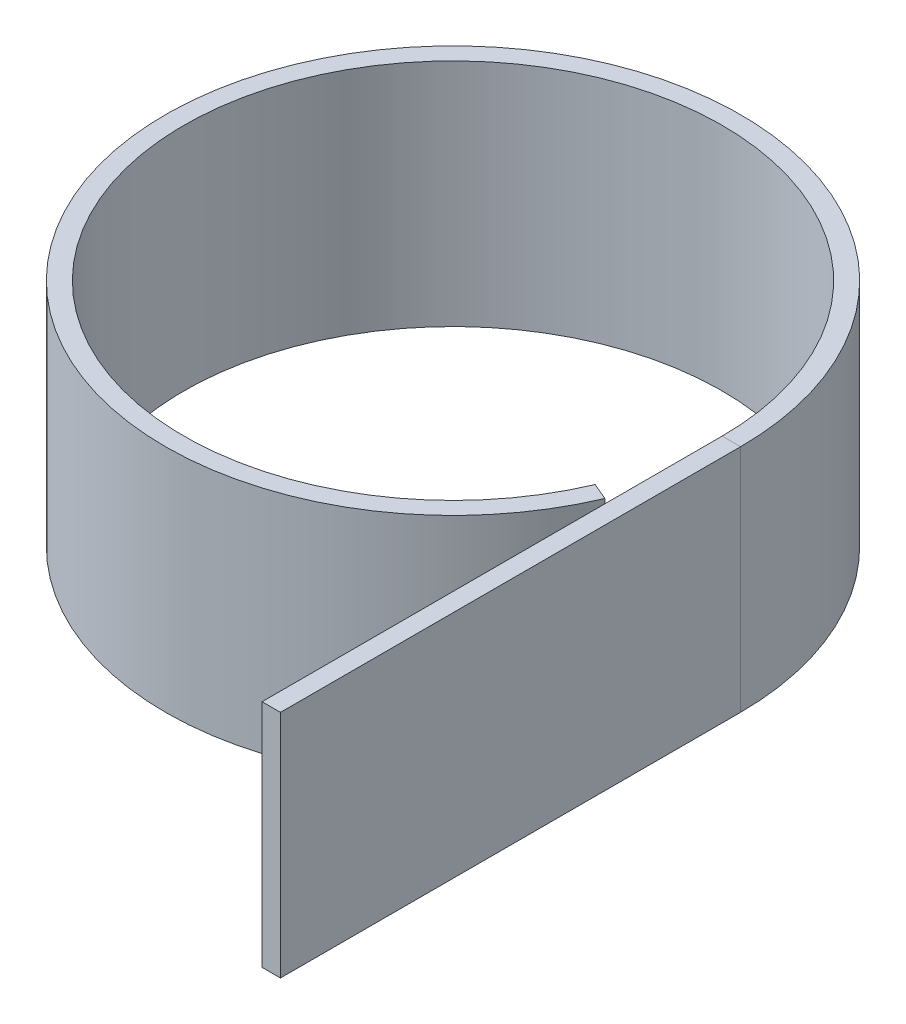
ISO-10303-21;
HEADER;
FILE_DESCRIPTION(('STEP AP214'),'2;1');
FILE_NAME('part.step','',(''),(''),'','','');
FILE_SCHEMA(('AUTOMOTIVE_DESIGN { 1 0 10303 214 1 1 1 1 }'));
ENDSEC;
DATA;
#1=APPLICATION_CONTEXT('core data for automotive mechanical design processes');
#2=APPLICATION_PROTOCOL_DEFINITION('international standard','automotive_design',2000,#1);
#3=PRODUCT_CONTEXT('',#1,'mechanical');
#4=PRODUCT('Part','Part','',(#3));
#5=PRODUCT_RELATED_PRODUCT_CATEGORY('part','',(#4));
#6=PRODUCT_DEFINITION_FORMATION('','',#4);
#7=PRODUCT_DEFINITION_CONTEXT('part definition',#1,'design');
#8=PRODUCT_DEFINITION('design','',#6,#7);
#9=PRODUCT_DEFINITION_SHAPE('','',#8);
#10=(LENGTH_UNIT() NAMED_UNIT(*) SI_UNIT(.MILLI.,.METRE.));
#11=(NAMED_UNIT(*) PLANE_ANGLE_UNIT() SI_UNIT($,.RADIAN.));
#12=(NAMED_UNIT(*) SI_UNIT($,.STERADIAN.) SOLID_ANGLE_UNIT());
#13=UNCERTAINTY_MEASURE_WITH_UNIT(LENGTH_MEASURE(1.E-05),#10,'distance_accuracy_value','');
#14=(GEOMETRIC_REPRESENTATION_CONTEXT(3) GLOBAL_UNCERTAINTY_ASSIGNED_CONTEXT((#13)) GLOBAL_UNIT_ASSIGNED_CONTEXT((#10,
#11,#12)) REPRESENTATION_CONTEXT('',''));
#15=CARTESIAN_POINT('',(0.,0.,0.));
#16=DIRECTION('',(0.,0.,1.));
#17=DIRECTION('',(1.,0.,0.));
#18=AXIS2_PLACEMENT_3D('',#15,#16,#17);
#19=CARTESIAN_POINT('',(12.5,10.,0.));
#20=DIRECTION('',(0.,1.,0.));
#21=DIRECTION('',(0.,0.,1.));
#22=AXIS2_PLACEMENT_3D('',#19,#20,#21);
#23=PLANE('',#22);
#24=DIRECTION('',(-1.,0.,0.));
#25=VECTOR('',#24,1.);
#26=CARTESIAN_POINT('',(12.5,10.,0.));
#27=LINE('',#26,#25);
#28=CARTESIAN_POINT('',(12.5,10.,0.));
#29=VERTEX_POINT('',#28);
#30=CARTESIAN_POINT('',(11.7,10.,0.));
#31=VERTEX_POINT('',#30);
#32=EDGE_CURVE('E11',#29,#31,#27,.T.);
#33=ORIENTED_EDGE('',*,*,#32,.F.);
#34=CARTESIAN_POINT('',(0.,10.,0.));
#35=DIRECTION('',(0.,-1.,0.));
#36=DIRECTION('',(0.,0.,1.));
#37=AXIS2_PLACEMENT_3D('',#34,#35,#36);
#38=CIRCLE('',#37,12.5);
#39=CARTESIAN_POINT('',(11.5,10.,4.89897948556636));
#40=VERTEX_POINT('',#39);
#41=EDGE_CURVE('E104',#40,#29,#38,.T.);
#42=ORIENTED_EDGE('',*,*,#41,.F.);
#43=DIRECTION('',(0.920000000000001,0.,0.391918358845305));
#44=VECTOR('',#43,1.);
#45=CARTESIAN_POINT('',(10.764,10.,4.58544479849011));
#46=LINE('',#45,#44);
#47=CARTESIAN_POINT('',(10.764,10.,4.58544479849011));
#48=VERTEX_POINT('',#47);
#49=EDGE_CURVE('E114',#48,#40,#46,.T.);
#50=ORIENTED_EDGE('',*,*,#49,.F.);
#51=CARTESIAN_POINT('',(0.,10.,0.));
#52=DIRECTION('',(0.,1.,0.));
#53=DIRECTION('',(1.,0.,0.));
#54=AXIS2_PLACEMENT_3D('',#51,#52,#53);
#55=CIRCLE('',#54,11.7);
#56=EDGE_CURVE('E119',#48,#31,#55,.F.);
#57=ORIENTED_EDGE('',*,*,#56,.T.);
#58=EDGE_LOOP('',(#33,#42,#50,#57));
#59=FACE_BOUND('',#58,.T.);
#60=ADVANCED_FACE('F43',(#59),#23,.T.);
#61=CARTESIAN_POINT('',(11.7,0.,0.));
#62=DIRECTION('',(0.,-1.,0.));
#63=DIRECTION('',(0.,0.,-1.));
#64=AXIS2_PLACEMENT_3D('',#61,#62,#63);
#65=PLANE('',#64);
#66=DIRECTION('',(1.,0.,0.));
#67=VECTOR('',#66,1.);
#68=CARTESIAN_POINT('',(11.7,0.,0.));
#69=LINE('',#68,#67);
#70=CARTESIAN_POINT('',(11.7,0.,0.));
#71=VERTEX_POINT('',#70);
#72=CARTESIAN_POINT('',(12.5,0.,0.));
#73=VERTEX_POINT('',#72);
#74=EDGE_CURVE('E51',#71,#73,#69,.T.);
#75=ORIENTED_EDGE('',*,*,#74,.F.);
#76=CARTESIAN_POINT('',(0.,0.,0.));
#77=DIRECTION('',(0.,1.,0.));
#78=DIRECTION('',(1.,0.,0.));
#79=AXIS2_PLACEMENT_3D('',#76,#77,#78);
#80=CIRCLE('',#79,11.7);
#81=CARTESIAN_POINT('',(10.764,0.,4.58544479849011));
#82=VERTEX_POINT('',#81);
#83=EDGE_CURVE('E137',#82,#71,#80,.F.);
#84=ORIENTED_EDGE('',*,*,#83,.F.);
#85=DIRECTION('',(0.920000000000001,0.,0.391918358845305));
#86=VECTOR('',#85,1.);
#87=CARTESIAN_POINT('',(10.764,0.,4.58544479849011));
#88=LINE('',#87,#86);
#89=CARTESIAN_POINT('',(11.5,0.,4.89897948556636));
#90=VERTEX_POINT('',#89);
#91=EDGE_CURVE('E135',#82,#90,#88,.T.);
#92=ORIENTED_EDGE('',*,*,#91,.T.);
#93=CARTESIAN_POINT('',(0.,0.,0.));
#94=DIRECTION('',(0.,-1.,0.));
#95=DIRECTION('',(0.,0.,1.));
#96=AXIS2_PLACEMENT_3D('',#93,#94,#95);
#97=CIRCLE('',#96,12.5);
#98=EDGE_CURVE('E105',#90,#73,#97,.T.);
#99=ORIENTED_EDGE('',*,*,#98,.T.);
#100=EDGE_LOOP('',(#75,#84,#92,#99));
#101=FACE_BOUND('',#100,.T.);
#102=ADVANCED_FACE('F154',(#101),#65,.T.);
#103=CARTESIAN_POINT('',(11.7,10.,0.));
#104=DIRECTION('',(1.,0.,0.));
#105=DIRECTION('',(0.,0.,-1.));
#106=AXIS2_PLACEMENT_3D('',#103,#104,#105);
#107=PLANE('',#106);
#108=DIRECTION('',(0.,0.,1.));
#109=VECTOR('',#108,1.);
#110=CARTESIAN_POINT('',(11.7,0.,0.));
#111=LINE('',#110,#109);
#112=CARTESIAN_POINT('',(11.7,0.,20.));
#113=VERTEX_POINT('',#112);
#114=EDGE_CURVE('E125',#71,#113,#111,.T.);
#115=ORIENTED_EDGE('',*,*,#114,.T.);
#116=DIRECTION('',(0.,-1.,0.));
#117=VECTOR('',#116,1.);
#118=CARTESIAN_POINT('',(11.7,10.,20.));
#119=LINE('',#118,#117);
#120=CARTESIAN_POINT('',(11.7,10.,20.));
#121=VERTEX_POINT('',#120);
#122=EDGE_CURVE('E145',#121,#113,#119,.T.);
#123=ORIENTED_EDGE('',*,*,#122,.F.);
#124=DIRECTION('',(0.,0.,1.));
#125=VECTOR('',#124,1.);
#126=CARTESIAN_POINT('',(11.7,10.,0.));
#127=LINE('',#126,#125);
#128=EDGE_CURVE('E90',#31,#121,#127,.T.);
#129=ORIENTED_EDGE('',*,*,#128,.F.);
#130=DIRECTION('',(0.,-1.,0.));
#131=VECTOR('',#130,1.);
#132=CARTESIAN_POINT('',(11.7,10.,0.));
#133=LINE('',#132,#131);
#134=EDGE_CURVE('E121',#31,#71,#133,.T.);
#135=ORIENTED_EDGE('',*,*,#134,.T.);
#136=EDGE_LOOP('',(#115,#123,#129,#135));
#137=FACE_BOUND('',#136,.T.);
#138=ADVANCED_FACE('F158',(#137),#107,.F.);
#139=CARTESIAN_POINT('',(12.5,10.,20.));
#140=DIRECTION('',(0.,0.,1.));
#141=DIRECTION('',(1.,0.,0.));
#142=AXIS2_PLACEMENT_3D('',#139,#140,#141);
#143=PLANE('',#142);
#144=DIRECTION('',(-1.,0.,0.));
#145=VECTOR('',#144,1.);
#146=CARTESIAN_POINT('',(12.5,0.,20.));
#147=LINE('',#146,#145);
#148=CARTESIAN_POINT('',(12.5,0.,20.));
#149=VERTEX_POINT('',#148);
#150=EDGE_CURVE('E128',#149,#113,#147,.T.);
#151=ORIENTED_EDGE('',*,*,#150,.F.);
#152=DIRECTION('',(0.,-1.,0.));
#153=VECTOR('',#152,1.);
#154=CARTESIAN_POINT('',(12.5,10.,20.));
#155=LINE('',#154,#153);
#156=CARTESIAN_POINT('',(12.5,10.,20.));
#157=VERTEX_POINT('',#156);
#158=EDGE_CURVE('E143',#157,#149,#155,.T.);
#159=ORIENTED_EDGE('',*,*,#158,.F.);
#160=DIRECTION('',(-1.,0.,0.));
#161=VECTOR('',#160,1.);
#162=CARTESIAN_POINT('',(12.5,10.,20.));
#163=LINE('',#162,#161);
#164=EDGE_CURVE('E160',#157,#121,#163,.T.);
#165=ORIENTED_EDGE('',*,*,#164,.T.);
#166=ORIENTED_EDGE('',*,*,#122,.T.);
#167=EDGE_LOOP('',(#151,#159,#165,#166));
#168=FACE_BOUND('',#167,.T.);
#169=ADVANCED_FACE('F165',(#168),#143,.T.);
#170=CARTESIAN_POINT('',(12.5,10.,0.));
#171=DIRECTION('',(1.,0.,0.));
#172=DIRECTION('',(0.,0.,-1.));
#173=AXIS2_PLACEMENT_3D('',#170,#171,#172);
#174=PLANE('',#173);
#175=DIRECTION('',(0.,0.,1.));
#176=VECTOR('',#175,1.);
#177=CARTESIAN_POINT('',(12.5,0.,0.));
#178=LINE('',#177,#176);
#179=EDGE_CURVE('E131',#73,#149,#178,.T.);
#180=ORIENTED_EDGE('',*,*,#179,.F.);
#181=DIRECTION('',(0.,-1.,0.));
#182=VECTOR('',#181,1.);
#183=CARTESIAN_POINT('',(12.5,10.,0.));
#184=LINE('',#183,#182);
#185=EDGE_CURVE('E110',#29,#73,#184,.T.);
#186=ORIENTED_EDGE('',*,*,#185,.F.);
#187=DIRECTION('',(0.,0.,1.));
#188=VECTOR('',#187,1.);
#189=CARTESIAN_POINT('',(12.5,10.,0.));
#190=LINE('',#189,#188);
#191=EDGE_CURVE('E116',#29,#157,#190,.T.);
#192=ORIENTED_EDGE('',*,*,#191,.T.);
#193=ORIENTED_EDGE('',*,*,#158,.T.);
#194=EDGE_LOOP('',(#180,#186,#192,#193));
#195=FACE_BOUND('',#194,.T.);
#196=ADVANCED_FACE('F152',(#195),#174,.T.);
#197=CARTESIAN_POINT('',(0.,10.,0.));
#198=DIRECTION('',(0.,-1.,0.));
#199=DIRECTION('',(0.,0.,-1.));
#200=AXIS2_PLACEMENT_3D('',#197,#198,#199);
#201=CYLINDRICAL_SURFACE('',#200,12.5);
#202=ORIENTED_EDGE('',*,*,#98,.F.);
#203=DIRECTION('',(0.,-1.,0.));
#204=VECTOR('',#203,1.);
#205=CARTESIAN_POINT('',(11.5,10.,4.89897948556636));
#206=LINE('',#205,#204);
#207=EDGE_CURVE('E100',#40,#90,#206,.T.);
#208=ORIENTED_EDGE('',*,*,#207,.F.);
#209=ORIENTED_EDGE('',*,*,#41,.T.);
#210=ORIENTED_EDGE('',*,*,#185,.T.);
#211=EDGE_LOOP('',(#202,#208,#209,#210));
#212=FACE_BOUND('',#211,.T.);
#213=ADVANCED_FACE('F102',(#212),#201,.T.);
#214=CARTESIAN_POINT('',(10.764,10.,4.58544479849011));
#215=DIRECTION('',(0.391918358845305,0.,-0.920000000000001));
#216=DIRECTION('',(-0.920000000000001,0.,-0.391918358845305));
#217=AXIS2_PLACEMENT_3D('',#214,#215,#216);
#218=PLANE('',#217);
#219=ORIENTED_EDGE('',*,*,#91,.F.);
#220=DIRECTION('',(0.,-1.,0.));
#221=VECTOR('',#220,1.);
#222=CARTESIAN_POINT('',(10.764,10.,4.58544479849011));
#223=LINE('',#222,#221);
#224=EDGE_CURVE('E80',#48,#82,#223,.T.);
#225=ORIENTED_EDGE('',*,*,#224,.F.);
#226=ORIENTED_EDGE('',*,*,#49,.T.);
#227=ORIENTED_EDGE('',*,*,#207,.T.);
#228=EDGE_LOOP('',(#219,#225,#226,#227));
#229=FACE_BOUND('',#228,.T.);
#230=ADVANCED_FACE('F118',(#229),#218,.T.);
#231=CARTESIAN_POINT('',(0.,10.,0.));
#232=DIRECTION('',(0.,-1.,0.));
#233=DIRECTION('',(0.,0.,-1.));
#234=AXIS2_PLACEMENT_3D('',#231,#232,#233);
#235=CYLINDRICAL_SURFACE('',#234,11.7);
#236=ORIENTED_EDGE('',*,*,#83,.T.);
#237=ORIENTED_EDGE('',*,*,#134,.F.);
#238=ORIENTED_EDGE('',*,*,#56,.F.);
#239=ORIENTED_EDGE('',*,*,#224,.T.);
#240=EDGE_LOOP('',(#236,#237,#238,#239));
#241=FACE_BOUND('',#240,.T.);
#242=ADVANCED_FACE('F156',(#241),#235,.F.);
#243=CARTESIAN_POINT('',(0.,10.,0.));
#244=DIRECTION('',(0.,-1.,0.));
#245=DIRECTION('',(-1.,0.,0.));
#246=AXIS2_PLACEMENT_3D('',#243,#244,#245);
#247=PLANE('',#246);
#248=ORIENTED_EDGE('',*,*,#128,.T.);
#249=ORIENTED_EDGE('',*,*,#164,.F.);
#250=ORIENTED_EDGE('',*,*,#191,.F.);
#251=ORIENTED_EDGE('',*,*,#32,.T.);
#252=EDGE_LOOP('',(#248,#249,#250,#251));
#253=FACE_BOUND('',#252,.T.);
#254=ADVANCED_FACE('F163',(#253),#247,.F.);
#255=CARTESIAN_POINT('',(0.,0.,0.));
#256=DIRECTION('',(0.,-1.,0.));
#257=DIRECTION('',(-1.,0.,0.));
#258=AXIS2_PLACEMENT_3D('',#255,#256,#257);
#259=PLANE('',#258);
#260=ORIENTED_EDGE('',*,*,#114,.F.);
#261=ORIENTED_EDGE('',*,*,#74,.T.);
#262=ORIENTED_EDGE('',*,*,#179,.T.);
#263=ORIENTED_EDGE('',*,*,#150,.T.);
#264=EDGE_LOOP('',(#260,#261,#262,#263));
#265=FACE_BOUND('',#264,.T.);
#266=ADVANCED_FACE('F148',(#265),#259,.T.);
#267=CLOSED_SHELL('',(#60,#102,#138,#169,#196,#213,#230,#242,#254,#266));
#268=MANIFOLD_SOLID_BREP('B2',#267);
#269=ADVANCED_BREP_SHAPE_REPRESENTATION('',(#18,#268),#14);
#270=SHAPE_DEFINITION_REPRESENTATION(#9,#269);
ENDSEC;
END-ISO-10303-21;
